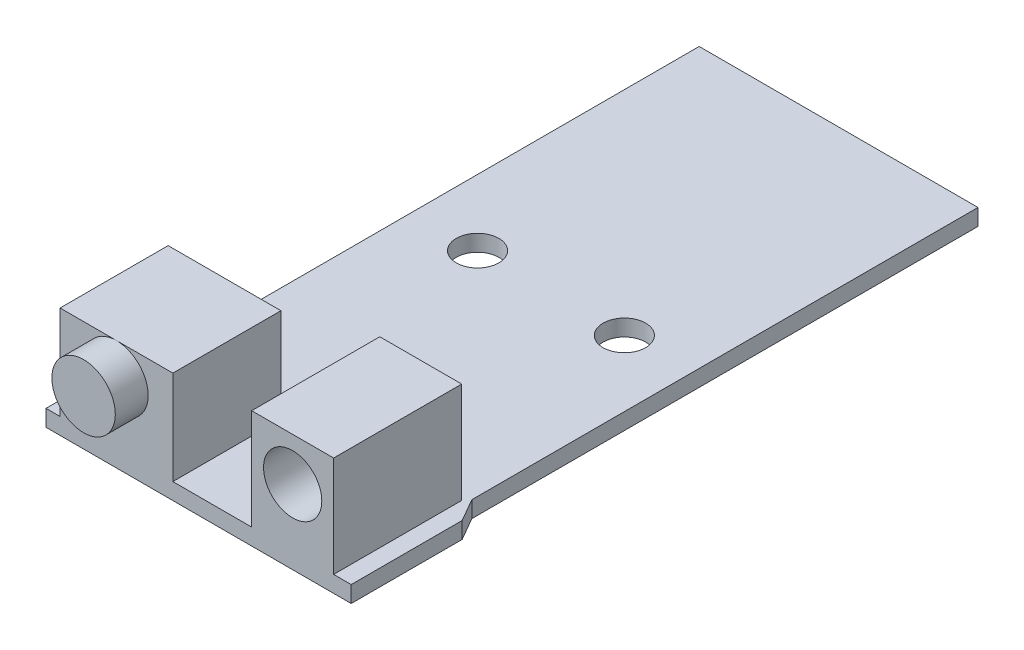
ISO-10303-21;
HEADER;
FILE_DESCRIPTION(('STEP AP214'),'2;1');
FILE_NAME('part.step','',(''),(''),'','','');
FILE_SCHEMA(('AUTOMOTIVE_DESIGN { 1 0 10303 214 1 1 1 1 }'));
ENDSEC;
DATA;
#1=APPLICATION_CONTEXT('core data for automotive mechanical design processes');
#2=APPLICATION_PROTOCOL_DEFINITION('international standard','automotive_design',2000,#1);
#3=PRODUCT_CONTEXT('',#1,'mechanical');
#4=PRODUCT('Part','Part','',(#3));
#5=PRODUCT_RELATED_PRODUCT_CATEGORY('part','',(#4));
#6=PRODUCT_DEFINITION_FORMATION('','',#4);
#7=PRODUCT_DEFINITION_CONTEXT('part definition',#1,'design');
#8=PRODUCT_DEFINITION('design','',#6,#7);
#9=PRODUCT_DEFINITION_SHAPE('','',#8);
#10=(LENGTH_UNIT() NAMED_UNIT(*) SI_UNIT(.MILLI.,.METRE.));
#11=(NAMED_UNIT(*) PLANE_ANGLE_UNIT() SI_UNIT($,.RADIAN.));
#12=(NAMED_UNIT(*) SI_UNIT($,.STERADIAN.) SOLID_ANGLE_UNIT());
#13=UNCERTAINTY_MEASURE_WITH_UNIT(LENGTH_MEASURE(1.E-05),#10,'distance_accuracy_value','');
#14=(GEOMETRIC_REPRESENTATION_CONTEXT(3) GLOBAL_UNCERTAINTY_ASSIGNED_CONTEXT((#13)) GLOBAL_UNIT_ASSIGNED_CONTEXT((#10,
#11,#12)) REPRESENTATION_CONTEXT('',''));
#15=CARTESIAN_POINT('',(0.,0.,0.));
#16=DIRECTION('',(0.,0.,1.));
#17=DIRECTION('',(1.,0.,0.));
#18=AXIS2_PLACEMENT_3D('',#15,#16,#17);
#19=CARTESIAN_POINT('',(0.,1.778,0.));
#20=DIRECTION('',(0.,-1.,0.));
#21=DIRECTION('',(0.,0.,-1.));
#22=AXIS2_PLACEMENT_3D('',#19,#20,#21);
#23=PLANE('',#22);
#24=CARTESIAN_POINT('',(7.9375,1.778,-38.1));
#25=DIRECTION('',(0.,1.,0.));
#26=DIRECTION('',(0.,0.,1.));
#27=AXIS2_PLACEMENT_3D('',#24,#25,#26);
#28=CIRCLE('',#27,2.3);
#29=CARTESIAN_POINT('',(7.9375,1.778,-35.8));
#30=VERTEX_POINT('',#29);
#31=EDGE_CURVE('E186',#30,#30,#28,.T.);
#32=ORIENTED_EDGE('',*,*,#31,.F.);
#33=EDGE_LOOP('',(#32));
#34=FACE_BOUND('',#33,.T.);
#35=CARTESIAN_POINT('',(-7.9375,1.778,-38.1));
#36=DIRECTION('',(0.,1.,0.));
#37=DIRECTION('',(0.,0.,1.));
#38=AXIS2_PLACEMENT_3D('',#35,#36,#37);
#39=CIRCLE('',#38,2.3);
#40=CARTESIAN_POINT('',(-7.9375,1.778,-35.8));
#41=VERTEX_POINT('',#40);
#42=EDGE_CURVE('E191',#41,#41,#39,.T.);
#43=ORIENTED_EDGE('',*,*,#42,.F.);
#44=EDGE_LOOP('',(#43));
#45=FACE_BOUND('',#44,.T.);
#46=DIRECTION('',(0.,0.,1.));
#47=VECTOR('',#46,1.);
#48=CARTESIAN_POINT('',(-14.976,1.778,0.));
#49=LINE('',#48,#47);
#50=CARTESIAN_POINT('',(-14.976,1.778,-11.684));
#51=VERTEX_POINT('',#50);
#52=CARTESIAN_POINT('',(-14.976,1.778,0.));
#53=VERTEX_POINT('',#52);
#54=EDGE_CURVE('E48',#51,#53,#49,.T.);
#55=ORIENTED_EDGE('',*,*,#54,.F.);
#56=DIRECTION('',(-1.,0.,0.));
#57=VECTOR('',#56,1.);
#58=CARTESIAN_POINT('',(-14.976,1.778,-11.684));
#59=LINE('',#58,#57);
#60=CARTESIAN_POINT('',(-2.784,1.778,-11.684));
#61=VERTEX_POINT('',#60);
#62=EDGE_CURVE('E52',#61,#51,#59,.T.);
#63=ORIENTED_EDGE('',*,*,#62,.F.);
#64=DIRECTION('',(0.,0.,-1.));
#65=VECTOR('',#64,1.);
#66=CARTESIAN_POINT('',(-2.784,1.778,0.));
#67=LINE('',#66,#65);
#68=CARTESIAN_POINT('',(-2.784,1.778,0.));
#69=VERTEX_POINT('',#68);
#70=EDGE_CURVE('E174',#69,#61,#67,.T.);
#71=ORIENTED_EDGE('',*,*,#70,.F.);
#72=DIRECTION('',(1.,0.,0.));
#73=VECTOR('',#72,1.);
#74=CARTESIAN_POINT('',(16.5,1.778,0.));
#75=LINE('',#74,#73);
#76=CARTESIAN_POINT('',(5.74,1.778,0.));
#77=VERTEX_POINT('',#76);
#78=EDGE_CURVE('E237',#69,#77,#75,.T.);
#79=ORIENTED_EDGE('',*,*,#78,.T.);
#80=DIRECTION('',(0.,0.,1.));
#81=VECTOR('',#80,1.);
#82=CARTESIAN_POINT('',(5.74,1.778,-13.85));
#83=LINE('',#82,#81);
#84=CARTESIAN_POINT('',(5.74,1.778,-13.85));
#85=VERTEX_POINT('',#84);
#86=EDGE_CURVE('E190',#85,#77,#83,.T.);
#87=ORIENTED_EDGE('',*,*,#86,.F.);
#88=DIRECTION('',(-1.,0.,0.));
#89=VECTOR('',#88,1.);
#90=CARTESIAN_POINT('',(5.74,1.778,-13.85));
#91=LINE('',#90,#89);
#92=CARTESIAN_POINT('',(14.6,1.778,-13.85));
#93=VERTEX_POINT('',#92);
#94=EDGE_CURVE('E203',#93,#85,#91,.T.);
#95=ORIENTED_EDGE('',*,*,#94,.F.);
#96=DIRECTION('',(0.,0.,-1.));
#97=VECTOR('',#96,1.);
#98=CARTESIAN_POINT('',(14.6,1.778,-13.85));
#99=LINE('',#98,#97);
#100=CARTESIAN_POINT('',(14.6,1.778,0.));
#101=VERTEX_POINT('',#100);
#102=EDGE_CURVE('E212',#101,#93,#99,.T.);
#103=ORIENTED_EDGE('',*,*,#102,.F.);
#104=CARTESIAN_POINT('',(16.5,1.778,0.));
#105=VERTEX_POINT('',#104);
#106=EDGE_CURVE('E232',#101,#105,#75,.T.);
#107=ORIENTED_EDGE('',*,*,#106,.T.);
#108=DIRECTION('',(0.,0.,-1.));
#109=VECTOR('',#108,1.);
#110=CARTESIAN_POINT('',(16.5,1.778,-12.));
#111=LINE('',#110,#109);
#112=CARTESIAN_POINT('',(16.5,1.778,-12.));
#113=VERTEX_POINT('',#112);
#114=EDGE_CURVE('E236',#105,#113,#111,.T.);
#115=ORIENTED_EDGE('',*,*,#114,.T.);
#116=DIRECTION('',(-0.500000000000001,0.,-0.866025403784438));
#117=VECTOR('',#116,1.);
#118=CARTESIAN_POINT('',(15.075,1.778,-14.4681724007856));
#119=LINE('',#118,#117);
#120=CARTESIAN_POINT('',(15.075,1.778,-14.4681724007856));
#121=VERTEX_POINT('',#120);
#122=EDGE_CURVE('E239',#113,#121,#119,.T.);
#123=ORIENTED_EDGE('',*,*,#122,.T.);
#124=DIRECTION('',(0.,0.,-1.));
#125=VECTOR('',#124,1.);
#126=CARTESIAN_POINT('',(15.075,1.778,-69.2));
#127=LINE('',#126,#125);
#128=CARTESIAN_POINT('',(15.075,1.778,-69.2));
#129=VERTEX_POINT('',#128);
#130=EDGE_CURVE('E241',#121,#129,#127,.T.);
#131=ORIENTED_EDGE('',*,*,#130,.T.);
#132=DIRECTION('',(-1.,0.,0.));
#133=VECTOR('',#132,1.);
#134=CARTESIAN_POINT('',(-15.075,1.778,-69.2));
#135=LINE('',#134,#133);
#136=CARTESIAN_POINT('',(-15.075,1.778,-69.2));
#137=VERTEX_POINT('',#136);
#138=EDGE_CURVE('E243',#129,#137,#135,.T.);
#139=ORIENTED_EDGE('',*,*,#138,.T.);
#140=DIRECTION('',(0.,0.,1.));
#141=VECTOR('',#140,1.);
#142=CARTESIAN_POINT('',(-15.075,1.778,-69.2));
#143=LINE('',#142,#141);
#144=CARTESIAN_POINT('',(-15.075,1.778,-14.4681724007856));
#145=VERTEX_POINT('',#144);
#146=EDGE_CURVE('E245',#137,#145,#143,.T.);
#147=ORIENTED_EDGE('',*,*,#146,.T.);
#148=DIRECTION('',(-0.500000000000001,0.,0.866025403784438));
#149=VECTOR('',#148,1.);
#150=CARTESIAN_POINT('',(-15.075,1.778,-14.4681724007856));
#151=LINE('',#150,#149);
#152=CARTESIAN_POINT('',(-16.5,1.778,-12.));
#153=VERTEX_POINT('',#152);
#154=EDGE_CURVE('E247',#145,#153,#151,.T.);
#155=ORIENTED_EDGE('',*,*,#154,.T.);
#156=DIRECTION('',(0.,0.,1.));
#157=VECTOR('',#156,1.);
#158=CARTESIAN_POINT('',(-16.5,1.778,-12.));
#159=LINE('',#158,#157);
#160=CARTESIAN_POINT('',(-16.5,1.778,0.));
#161=VERTEX_POINT('',#160);
#162=EDGE_CURVE('E229',#153,#161,#159,.T.);
#163=ORIENTED_EDGE('',*,*,#162,.T.);
#164=EDGE_CURVE('E234',#161,#53,#75,.T.);
#165=ORIENTED_EDGE('',*,*,#164,.T.);
#166=EDGE_LOOP('',(#55,#63,#71,#79,#87,#95,#103,#107,#115,#123,#131,#139,#147,#155,#163,#165));
#167=FACE_BOUND('',#166,.T.);
#168=ADVANCED_FACE('F33',(#34,#45,#167),#23,.F.);
#169=CARTESIAN_POINT('',(-16.5,1.778,-12.));
#170=DIRECTION('',(1.,0.,0.));
#171=DIRECTION('',(0.,0.,-1.));
#172=AXIS2_PLACEMENT_3D('',#169,#170,#171);
#173=PLANE('',#172);
#174=DIRECTION('',(0.,0.,1.));
#175=VECTOR('',#174,1.);
#176=CARTESIAN_POINT('',(-16.5,0.,-12.));
#177=LINE('',#176,#175);
#178=CARTESIAN_POINT('',(-16.5,0.,-12.));
#179=VERTEX_POINT('',#178);
#180=CARTESIAN_POINT('',(-16.5,0.,0.));
#181=VERTEX_POINT('',#180);
#182=EDGE_CURVE('E228',#179,#181,#177,.T.);
#183=ORIENTED_EDGE('',*,*,#182,.T.);
#184=DIRECTION('',(0.,-1.,0.));
#185=VECTOR('',#184,1.);
#186=CARTESIAN_POINT('',(-16.5,1.778,0.));
#187=LINE('',#186,#185);
#188=EDGE_CURVE('E11',#161,#181,#187,.T.);
#189=ORIENTED_EDGE('',*,*,#188,.F.);
#190=ORIENTED_EDGE('',*,*,#162,.F.);
#191=DIRECTION('',(0.,-1.,0.));
#192=VECTOR('',#191,1.);
#193=CARTESIAN_POINT('',(-16.5,1.778,-12.));
#194=LINE('',#193,#192);
#195=EDGE_CURVE('E249',#153,#179,#194,.T.);
#196=ORIENTED_EDGE('',*,*,#195,.T.);
#197=EDGE_LOOP('',(#183,#189,#190,#196));
#198=FACE_BOUND('',#197,.T.);
#199=ADVANCED_FACE('F35',(#198),#173,.F.);
#200=CARTESIAN_POINT('',(16.5,1.778,0.));
#201=DIRECTION('',(0.,0.,-1.));
#202=DIRECTION('',(-1.,0.,0.));
#203=AXIS2_PLACEMENT_3D('',#200,#201,#202);
#204=PLANE('',#203);
#205=CARTESIAN_POINT('',(10.17,8.0044,0.));
#206=DIRECTION('',(0.,0.,1.));
#207=DIRECTION('',(1.,0.,0.));
#208=AXIS2_PLACEMENT_3D('',#205,#206,#207);
#209=CIRCLE('',#208,3.1496);
#210=CARTESIAN_POINT('',(13.3196,8.0044,0.));
#211=VERTEX_POINT('',#210);
#212=EDGE_CURVE('E373',#211,#211,#209,.T.);
#213=ORIENTED_EDGE('',*,*,#212,.F.);
#214=EDGE_LOOP('',(#213));
#215=FACE_BOUND('',#214,.T.);
#216=DIRECTION('',(1.,0.,0.));
#217=VECTOR('',#216,1.);
#218=CARTESIAN_POINT('',(-14.976,11.938,0.));
#219=LINE('',#218,#217);
#220=CARTESIAN_POINT('',(-8.88,11.938,0.));
#221=VERTEX_POINT('',#220);
#222=CARTESIAN_POINT('',(-2.784,11.938,0.));
#223=VERTEX_POINT('',#222);
#224=EDGE_CURVE('E150',#221,#223,#219,.T.);
#225=ORIENTED_EDGE('',*,*,#224,.F.);
#226=CARTESIAN_POINT('',(-8.88,8.509,0.));
#227=DIRECTION('',(0.,0.,1.));
#228=DIRECTION('',(1.,0.,0.));
#229=AXIS2_PLACEMENT_3D('',#226,#227,#228);
#230=CIRCLE('',#229,3.429);
#231=EDGE_CURVE('E162',#221,#221,#230,.T.);
#232=ORIENTED_EDGE('',*,*,#231,.F.);
#233=CARTESIAN_POINT('',(-14.976,11.938,0.));
#234=VERTEX_POINT('',#233);
#235=EDGE_CURVE('E147',#234,#221,#219,.T.);
#236=ORIENTED_EDGE('',*,*,#235,.F.);
#237=DIRECTION('',(0.,-1.,0.));
#238=VECTOR('',#237,1.);
#239=CARTESIAN_POINT('',(-14.976,11.938,0.));
#240=LINE('',#239,#238);
#241=EDGE_CURVE('E184',#234,#53,#240,.T.);
#242=ORIENTED_EDGE('',*,*,#241,.T.);
#243=ORIENTED_EDGE('',*,*,#164,.F.);
#244=ORIENTED_EDGE('',*,*,#188,.T.);
#245=DIRECTION('',(1.,0.,0.));
#246=VECTOR('',#245,1.);
#247=CARTESIAN_POINT('',(16.5,0.,0.));
#248=LINE('',#247,#246);
#249=CARTESIAN_POINT('',(16.5,0.,0.));
#250=VERTEX_POINT('',#249);
#251=EDGE_CURVE('E252',#181,#250,#248,.T.);
#252=ORIENTED_EDGE('',*,*,#251,.T.);
#253=DIRECTION('',(0.,-1.,0.));
#254=VECTOR('',#253,1.);
#255=CARTESIAN_POINT('',(16.5,1.778,0.));
#256=LINE('',#255,#254);
#257=EDGE_CURVE('E41',#105,#250,#256,.T.);
#258=ORIENTED_EDGE('',*,*,#257,.F.);
#259=ORIENTED_EDGE('',*,*,#106,.F.);
#260=DIRECTION('',(0.,-1.,0.));
#261=VECTOR('',#260,1.);
#262=CARTESIAN_POINT('',(14.6,12.678,0.));
#263=LINE('',#262,#261);
#264=CARTESIAN_POINT('',(14.6,12.678,0.));
#265=VERTEX_POINT('',#264);
#266=EDGE_CURVE('E222',#265,#101,#263,.T.);
#267=ORIENTED_EDGE('',*,*,#266,.F.);
#268=DIRECTION('',(1.,0.,0.));
#269=VECTOR('',#268,1.);
#270=CARTESIAN_POINT('',(5.74,12.678,0.));
#271=LINE('',#270,#269);
#272=CARTESIAN_POINT('',(5.74,12.678,0.));
#273=VERTEX_POINT('',#272);
#274=EDGE_CURVE('E202',#273,#265,#271,.T.);
#275=ORIENTED_EDGE('',*,*,#274,.F.);
#276=DIRECTION('',(0.,-1.,0.));
#277=VECTOR('',#276,1.);
#278=CARTESIAN_POINT('',(5.74,12.678,0.));
#279=LINE('',#278,#277);
#280=EDGE_CURVE('E225',#273,#77,#279,.T.);
#281=ORIENTED_EDGE('',*,*,#280,.T.);
#282=ORIENTED_EDGE('',*,*,#78,.F.);
#283=DIRECTION('',(0.,-1.,0.));
#284=VECTOR('',#283,1.);
#285=CARTESIAN_POINT('',(-2.784,11.938,0.));
#286=LINE('',#285,#284);
#287=EDGE_CURVE('E164',#223,#69,#286,.T.);
#288=ORIENTED_EDGE('',*,*,#287,.F.);
#289=EDGE_LOOP('',(#225,#232,#236,#242,#243,#244,#252,#258,#259,#267,#275,#281,#282,#288));
#290=FACE_BOUND('',#289,.T.);
#291=ADVANCED_FACE('F160',(#215,#290),#204,.F.);
#292=CARTESIAN_POINT('',(16.5,1.778,-12.));
#293=DIRECTION('',(-1.,0.,0.));
#294=DIRECTION('',(0.,0.,1.));
#295=AXIS2_PLACEMENT_3D('',#292,#293,#294);
#296=PLANE('',#295);
#297=DIRECTION('',(0.,0.,-1.));
#298=VECTOR('',#297,1.);
#299=CARTESIAN_POINT('',(16.5,0.,-12.));
#300=LINE('',#299,#298);
#301=CARTESIAN_POINT('',(16.5,0.,-12.));
#302=VERTEX_POINT('',#301);
#303=EDGE_CURVE('E254',#250,#302,#300,.T.);
#304=ORIENTED_EDGE('',*,*,#303,.T.);
#305=DIRECTION('',(0.,-1.,0.));
#306=VECTOR('',#305,1.);
#307=CARTESIAN_POINT('',(16.5,1.778,-12.));
#308=LINE('',#307,#306);
#309=EDGE_CURVE('E279',#113,#302,#308,.T.);
#310=ORIENTED_EDGE('',*,*,#309,.F.);
#311=ORIENTED_EDGE('',*,*,#114,.F.);
#312=ORIENTED_EDGE('',*,*,#257,.T.);
#313=EDGE_LOOP('',(#304,#310,#311,#312));
#314=FACE_BOUND('',#313,.T.);
#315=ADVANCED_FACE('F286',(#314),#296,.F.);
#316=CARTESIAN_POINT('',(15.075,1.778,-14.4681724007856));
#317=DIRECTION('',(-0.866025403784438,0.,0.500000000000001));
#318=DIRECTION('',(0.500000000000001,0.,0.866025403784438));
#319=AXIS2_PLACEMENT_3D('',#316,#317,#318);
#320=PLANE('',#319);
#321=DIRECTION('',(-0.500000000000001,0.,-0.866025403784438));
#322=VECTOR('',#321,1.);
#323=CARTESIAN_POINT('',(15.075,0.,-14.4681724007856));
#324=LINE('',#323,#322);
#325=CARTESIAN_POINT('',(15.075,0.,-14.4681724007856));
#326=VERTEX_POINT('',#325);
#327=EDGE_CURVE('E256',#302,#326,#324,.T.);
#328=ORIENTED_EDGE('',*,*,#327,.T.);
#329=DIRECTION('',(0.,-1.,0.));
#330=VECTOR('',#329,1.);
#331=CARTESIAN_POINT('',(15.075,1.778,-14.4681724007856));
#332=LINE('',#331,#330);
#333=EDGE_CURVE('E276',#121,#326,#332,.T.);
#334=ORIENTED_EDGE('',*,*,#333,.F.);
#335=ORIENTED_EDGE('',*,*,#122,.F.);
#336=ORIENTED_EDGE('',*,*,#309,.T.);
#337=EDGE_LOOP('',(#328,#334,#335,#336));
#338=FACE_BOUND('',#337,.T.);
#339=ADVANCED_FACE('F297',(#338),#320,.F.);
#340=CARTESIAN_POINT('',(15.075,1.778,-69.2));
#341=DIRECTION('',(-1.,0.,0.));
#342=DIRECTION('',(0.,0.,1.));
#343=AXIS2_PLACEMENT_3D('',#340,#341,#342);
#344=PLANE('',#343);
#345=DIRECTION('',(0.,0.,-1.));
#346=VECTOR('',#345,1.);
#347=CARTESIAN_POINT('',(15.075,0.,-69.2));
#348=LINE('',#347,#346);
#349=CARTESIAN_POINT('',(15.075,0.,-69.2));
#350=VERTEX_POINT('',#349);
#351=EDGE_CURVE('E258',#326,#350,#348,.T.);
#352=ORIENTED_EDGE('',*,*,#351,.T.);
#353=DIRECTION('',(0.,-1.,0.));
#354=VECTOR('',#353,1.);
#355=CARTESIAN_POINT('',(15.075,1.778,-69.2));
#356=LINE('',#355,#354);
#357=EDGE_CURVE('E273',#129,#350,#356,.T.);
#358=ORIENTED_EDGE('',*,*,#357,.F.);
#359=ORIENTED_EDGE('',*,*,#130,.F.);
#360=ORIENTED_EDGE('',*,*,#333,.T.);
#361=EDGE_LOOP('',(#352,#358,#359,#360));
#362=FACE_BOUND('',#361,.T.);
#363=ADVANCED_FACE('F301',(#362),#344,.F.);
#364=CARTESIAN_POINT('',(-15.075,1.778,-69.2));
#365=DIRECTION('',(0.,0.,1.));
#366=DIRECTION('',(1.,0.,0.));
#367=AXIS2_PLACEMENT_3D('',#364,#365,#366);
#368=PLANE('',#367);
#369=DIRECTION('',(-1.,0.,0.));
#370=VECTOR('',#369,1.);
#371=CARTESIAN_POINT('',(-15.075,0.,-69.2));
#372=LINE('',#371,#370);
#373=CARTESIAN_POINT('',(-15.075,0.,-69.2));
#374=VERTEX_POINT('',#373);
#375=EDGE_CURVE('E260',#350,#374,#372,.T.);
#376=ORIENTED_EDGE('',*,*,#375,.T.);
#377=DIRECTION('',(0.,-1.,0.));
#378=VECTOR('',#377,1.);
#379=CARTESIAN_POINT('',(-15.075,1.778,-69.2));
#380=LINE('',#379,#378);
#381=EDGE_CURVE('E270',#137,#374,#380,.T.);
#382=ORIENTED_EDGE('',*,*,#381,.F.);
#383=ORIENTED_EDGE('',*,*,#138,.F.);
#384=ORIENTED_EDGE('',*,*,#357,.T.);
#385=EDGE_LOOP('',(#376,#382,#383,#384));
#386=FACE_BOUND('',#385,.T.);
#387=ADVANCED_FACE('F355',(#386),#368,.F.);
#388=CARTESIAN_POINT('',(-15.075,1.778,-69.2));
#389=DIRECTION('',(1.,0.,0.));
#390=DIRECTION('',(0.,0.,-1.));
#391=AXIS2_PLACEMENT_3D('',#388,#389,#390);
#392=PLANE('',#391);
#393=DIRECTION('',(0.,0.,1.));
#394=VECTOR('',#393,1.);
#395=CARTESIAN_POINT('',(-15.075,0.,-69.2));
#396=LINE('',#395,#394);
#397=CARTESIAN_POINT('',(-15.075,0.,-14.4681724007856));
#398=VERTEX_POINT('',#397);
#399=EDGE_CURVE('E262',#374,#398,#396,.T.);
#400=ORIENTED_EDGE('',*,*,#399,.T.);
#401=DIRECTION('',(0.,-1.,0.));
#402=VECTOR('',#401,1.);
#403=CARTESIAN_POINT('',(-15.075,1.778,-14.4681724007856));
#404=LINE('',#403,#402);
#405=EDGE_CURVE('E267',#145,#398,#404,.T.);
#406=ORIENTED_EDGE('',*,*,#405,.F.);
#407=ORIENTED_EDGE('',*,*,#146,.F.);
#408=ORIENTED_EDGE('',*,*,#381,.T.);
#409=EDGE_LOOP('',(#400,#406,#407,#408));
#410=FACE_BOUND('',#409,.T.);
#411=ADVANCED_FACE('F351',(#410),#392,.F.);
#412=CARTESIAN_POINT('',(-15.075,1.778,-14.4681724007856));
#413=DIRECTION('',(0.866025403784438,0.,0.500000000000001));
#414=DIRECTION('',(0.500000000000001,0.,-0.866025403784438));
#415=AXIS2_PLACEMENT_3D('',#412,#413,#414);
#416=PLANE('',#415);
#417=DIRECTION('',(-0.500000000000001,0.,0.866025403784438));
#418=VECTOR('',#417,1.);
#419=CARTESIAN_POINT('',(-15.075,0.,-14.4681724007856));
#420=LINE('',#419,#418);
#421=EDGE_CURVE('E233',#398,#179,#420,.T.);
#422=ORIENTED_EDGE('',*,*,#421,.T.);
#423=ORIENTED_EDGE('',*,*,#195,.F.);
#424=ORIENTED_EDGE('',*,*,#154,.F.);
#425=ORIENTED_EDGE('',*,*,#405,.T.);
#426=EDGE_LOOP('',(#422,#423,#424,#425));
#427=FACE_BOUND('',#426,.T.);
#428=ADVANCED_FACE('F347',(#427),#416,.F.);
#429=CARTESIAN_POINT('',(0.,0.,0.));
#430=DIRECTION('',(0.,-1.,0.));
#431=DIRECTION('',(0.,0.,-1.));
#432=AXIS2_PLACEMENT_3D('',#429,#430,#431);
#433=PLANE('',#432);
#434=CARTESIAN_POINT('',(-7.9375,0.,-38.1));
#435=DIRECTION('',(0.,1.,0.));
#436=DIRECTION('',(0.,0.,1.));
#437=AXIS2_PLACEMENT_3D('',#434,#435,#436);
#438=CIRCLE('',#437,2.3);
#439=CARTESIAN_POINT('',(-7.9375,0.,-35.8));
#440=VERTEX_POINT('',#439);
#441=EDGE_CURVE('E187',#440,#440,#438,.T.);
#442=ORIENTED_EDGE('',*,*,#441,.T.);
#443=EDGE_LOOP('',(#442));
#444=FACE_BOUND('',#443,.T.);
#445=CARTESIAN_POINT('',(7.9375,0.,-38.1));
#446=DIRECTION('',(0.,1.,0.));
#447=DIRECTION('',(0.,0.,1.));
#448=AXIS2_PLACEMENT_3D('',#445,#446,#447);
#449=CIRCLE('',#448,2.3);
#450=CARTESIAN_POINT('',(7.9375,0.,-35.8));
#451=VERTEX_POINT('',#450);
#452=EDGE_CURVE('E194',#451,#451,#449,.T.);
#453=ORIENTED_EDGE('',*,*,#452,.T.);
#454=EDGE_LOOP('',(#453));
#455=FACE_BOUND('',#454,.T.);
#456=ORIENTED_EDGE('',*,*,#182,.F.);
#457=ORIENTED_EDGE('',*,*,#421,.F.);
#458=ORIENTED_EDGE('',*,*,#399,.F.);
#459=ORIENTED_EDGE('',*,*,#375,.F.);
#460=ORIENTED_EDGE('',*,*,#351,.F.);
#461=ORIENTED_EDGE('',*,*,#327,.F.);
#462=ORIENTED_EDGE('',*,*,#303,.F.);
#463=ORIENTED_EDGE('',*,*,#251,.F.);
#464=EDGE_LOOP('',(#456,#457,#458,#459,#460,#461,#462,#463));
#465=FACE_BOUND('',#464,.T.);
#466=ADVANCED_FACE('F292',(#444,#455,#465),#433,.T.);
#467=CARTESIAN_POINT('',(5.74,12.678,-13.85));
#468=DIRECTION('',(1.,0.,0.));
#469=DIRECTION('',(0.,0.,-1.));
#470=AXIS2_PLACEMENT_3D('',#467,#468,#469);
#471=PLANE('',#470);
#472=ORIENTED_EDGE('',*,*,#86,.T.);
#473=ORIENTED_EDGE('',*,*,#280,.F.);
#474=DIRECTION('',(0.,0.,1.));
#475=VECTOR('',#474,1.);
#476=CARTESIAN_POINT('',(5.74,12.678,-13.85));
#477=LINE('',#476,#475);
#478=CARTESIAN_POINT('',(5.74,12.678,-13.85));
#479=VERTEX_POINT('',#478);
#480=EDGE_CURVE('E199',#479,#273,#477,.T.);
#481=ORIENTED_EDGE('',*,*,#480,.F.);
#482=DIRECTION('',(0.,-1.,0.));
#483=VECTOR('',#482,1.);
#484=CARTESIAN_POINT('',(5.74,12.678,-13.85));
#485=LINE('',#484,#483);
#486=EDGE_CURVE('E209',#479,#85,#485,.T.);
#487=ORIENTED_EDGE('',*,*,#486,.T.);
#488=EDGE_LOOP('',(#472,#473,#481,#487));
#489=FACE_BOUND('',#488,.T.);
#490=ADVANCED_FACE('F309',(#489),#471,.F.);
#491=CARTESIAN_POINT('',(14.6,12.678,-13.85));
#492=DIRECTION('',(-1.,0.,0.));
#493=DIRECTION('',(0.,0.,1.));
#494=AXIS2_PLACEMENT_3D('',#491,#492,#493);
#495=PLANE('',#494);
#496=ORIENTED_EDGE('',*,*,#102,.T.);
#497=DIRECTION('',(0.,-1.,0.));
#498=VECTOR('',#497,1.);
#499=CARTESIAN_POINT('',(14.6,12.678,-13.85));
#500=LINE('',#499,#498);
#501=CARTESIAN_POINT('',(14.6,12.678,-13.85));
#502=VERTEX_POINT('',#501);
#503=EDGE_CURVE('E219',#502,#93,#500,.T.);
#504=ORIENTED_EDGE('',*,*,#503,.F.);
#505=DIRECTION('',(0.,0.,-1.));
#506=VECTOR('',#505,1.);
#507=CARTESIAN_POINT('',(14.6,12.678,-13.85));
#508=LINE('',#507,#506);
#509=EDGE_CURVE('E205',#265,#502,#508,.T.);
#510=ORIENTED_EDGE('',*,*,#509,.F.);
#511=ORIENTED_EDGE('',*,*,#266,.T.);
#512=EDGE_LOOP('',(#496,#504,#510,#511));
#513=FACE_BOUND('',#512,.T.);
#514=ADVANCED_FACE('F316',(#513),#495,.F.);
#515=CARTESIAN_POINT('',(5.74,12.678,-13.85));
#516=DIRECTION('',(0.,0.,1.));
#517=DIRECTION('',(1.,0.,0.));
#518=AXIS2_PLACEMENT_3D('',#515,#516,#517);
#519=PLANE('',#518);
#520=ORIENTED_EDGE('',*,*,#94,.T.);
#521=ORIENTED_EDGE('',*,*,#486,.F.);
#522=DIRECTION('',(-1.,0.,0.));
#523=VECTOR('',#522,1.);
#524=CARTESIAN_POINT('',(5.74,12.678,-13.85));
#525=LINE('',#524,#523);
#526=EDGE_CURVE('E207',#502,#479,#525,.T.);
#527=ORIENTED_EDGE('',*,*,#526,.F.);
#528=ORIENTED_EDGE('',*,*,#503,.T.);
#529=EDGE_LOOP('',(#520,#521,#527,#528));
#530=FACE_BOUND('',#529,.T.);
#531=ADVANCED_FACE('F313',(#530),#519,.F.);
#532=CARTESIAN_POINT('',(0.,12.678,0.));
#533=DIRECTION('',(0.,1.,0.));
#534=DIRECTION('',(0.,0.,1.));
#535=AXIS2_PLACEMENT_3D('',#532,#533,#534);
#536=PLANE('',#535);
#537=ORIENTED_EDGE('',*,*,#480,.T.);
#538=ORIENTED_EDGE('',*,*,#274,.T.);
#539=ORIENTED_EDGE('',*,*,#509,.T.);
#540=ORIENTED_EDGE('',*,*,#526,.T.);
#541=EDGE_LOOP('',(#537,#538,#539,#540));
#542=FACE_BOUND('',#541,.T.);
#543=ADVANCED_FACE('F319',(#542),#536,.T.);
#544=CARTESIAN_POINT('',(7.9375,0.,-38.1));
#545=DIRECTION('',(0.,1.,0.));
#546=DIRECTION('',(0.,0.,1.));
#547=AXIS2_PLACEMENT_3D('',#544,#545,#546);
#548=CYLINDRICAL_SURFACE('',#547,2.3);
#549=ORIENTED_EDGE('',*,*,#452,.F.);
#550=EDGE_LOOP('',(#549));
#551=FACE_BOUND('',#550,.T.);
#552=ORIENTED_EDGE('',*,*,#31,.T.);
#553=EDGE_LOOP('',(#552));
#554=FACE_BOUND('',#553,.T.);
#555=ADVANCED_FACE('F321',(#551,#554),#548,.F.);
#556=CARTESIAN_POINT('',(-7.9375,0.,-38.1));
#557=DIRECTION('',(0.,1.,0.));
#558=DIRECTION('',(0.,0.,1.));
#559=AXIS2_PLACEMENT_3D('',#556,#557,#558);
#560=CYLINDRICAL_SURFACE('',#559,2.3);
#561=ORIENTED_EDGE('',*,*,#441,.F.);
#562=EDGE_LOOP('',(#561));
#563=FACE_BOUND('',#562,.T.);
#564=ORIENTED_EDGE('',*,*,#42,.T.);
#565=EDGE_LOOP('',(#564));
#566=FACE_BOUND('',#565,.T.);
#567=ADVANCED_FACE('F327',(#563,#566),#560,.F.);
#568=CARTESIAN_POINT('',(-14.976,11.938,0.));
#569=DIRECTION('',(1.,0.,0.));
#570=DIRECTION('',(0.,0.,-1.));
#571=AXIS2_PLACEMENT_3D('',#568,#569,#570);
#572=PLANE('',#571);
#573=ORIENTED_EDGE('',*,*,#54,.T.);
#574=ORIENTED_EDGE('',*,*,#241,.F.);
#575=DIRECTION('',(0.,0.,1.));
#576=VECTOR('',#575,1.);
#577=CARTESIAN_POINT('',(-14.976,11.938,0.));
#578=LINE('',#577,#576);
#579=CARTESIAN_POINT('',(-14.976,11.938,-11.684));
#580=VERTEX_POINT('',#579);
#581=EDGE_CURVE('E153',#580,#234,#578,.T.);
#582=ORIENTED_EDGE('',*,*,#581,.F.);
#583=DIRECTION('',(0.,-1.,0.));
#584=VECTOR('',#583,1.);
#585=CARTESIAN_POINT('',(-14.976,11.938,-11.684));
#586=LINE('',#585,#584);
#587=EDGE_CURVE('E172',#580,#51,#586,.T.);
#588=ORIENTED_EDGE('',*,*,#587,.T.);
#589=EDGE_LOOP('',(#573,#574,#582,#588));
#590=FACE_BOUND('',#589,.T.);
#591=ADVANCED_FACE('F405',(#590),#572,.F.);
#592=CARTESIAN_POINT('',(-2.784,11.938,0.));
#593=DIRECTION('',(-1.,0.,0.));
#594=DIRECTION('',(0.,0.,1.));
#595=AXIS2_PLACEMENT_3D('',#592,#593,#594);
#596=PLANE('',#595);
#597=ORIENTED_EDGE('',*,*,#70,.T.);
#598=DIRECTION('',(0.,-1.,0.));
#599=VECTOR('',#598,1.);
#600=CARTESIAN_POINT('',(-2.784,11.938,-11.684));
#601=LINE('',#600,#599);
#602=CARTESIAN_POINT('',(-2.784,11.938,-11.684));
#603=VERTEX_POINT('',#602);
#604=EDGE_CURVE('E180',#603,#61,#601,.T.);
#605=ORIENTED_EDGE('',*,*,#604,.F.);
#606=DIRECTION('',(0.,0.,-1.));
#607=VECTOR('',#606,1.);
#608=CARTESIAN_POINT('',(-2.784,11.938,0.));
#609=LINE('',#608,#607);
#610=EDGE_CURVE('E158',#223,#603,#609,.T.);
#611=ORIENTED_EDGE('',*,*,#610,.F.);
#612=ORIENTED_EDGE('',*,*,#287,.T.);
#613=EDGE_LOOP('',(#597,#605,#611,#612));
#614=FACE_BOUND('',#613,.T.);
#615=ADVANCED_FACE('F401',(#614),#596,.F.);
#616=CARTESIAN_POINT('',(-14.976,11.938,-11.684));
#617=DIRECTION('',(0.,0.,1.));
#618=DIRECTION('',(1.,0.,0.));
#619=AXIS2_PLACEMENT_3D('',#616,#617,#618);
#620=PLANE('',#619);
#621=ORIENTED_EDGE('',*,*,#62,.T.);
#622=ORIENTED_EDGE('',*,*,#587,.F.);
#623=DIRECTION('',(-1.,0.,0.));
#624=VECTOR('',#623,1.);
#625=CARTESIAN_POINT('',(-14.976,11.938,-11.684));
#626=LINE('',#625,#624);
#627=EDGE_CURVE('E170',#603,#580,#626,.T.);
#628=ORIENTED_EDGE('',*,*,#627,.F.);
#629=ORIENTED_EDGE('',*,*,#604,.T.);
#630=EDGE_LOOP('',(#621,#622,#628,#629));
#631=FACE_BOUND('',#630,.T.);
#632=ADVANCED_FACE('F394',(#631),#620,.F.);
#633=CARTESIAN_POINT('',(0.,11.938,0.));
#634=DIRECTION('',(0.,-1.,0.));
#635=DIRECTION('',(0.,0.,-1.));
#636=AXIS2_PLACEMENT_3D('',#633,#634,#635);
#637=PLANE('',#636);
#638=ORIENTED_EDGE('',*,*,#581,.T.);
#639=ORIENTED_EDGE('',*,*,#235,.T.);
#640=ORIENTED_EDGE('',*,*,#224,.T.);
#641=ORIENTED_EDGE('',*,*,#610,.T.);
#642=ORIENTED_EDGE('',*,*,#627,.T.);
#643=EDGE_LOOP('',(#638,#639,#640,#641,#642));
#644=FACE_BOUND('',#643,.T.);
#645=ADVANCED_FACE('F149',(#644),#637,.F.);
#646=CARTESIAN_POINT('',(-8.88,8.509,3.556));
#647=DIRECTION('',(0.,0.,-1.));
#648=DIRECTION('',(-1.,0.,0.));
#649=AXIS2_PLACEMENT_3D('',#646,#647,#648);
#650=CYLINDRICAL_SURFACE('',#649,3.429);
#651=CARTESIAN_POINT('',(-8.88,8.509,3.556));
#652=DIRECTION('',(0.,0.,1.));
#653=DIRECTION('',(1.,0.,0.));
#654=AXIS2_PLACEMENT_3D('',#651,#652,#653);
#655=CIRCLE('',#654,3.429);
#656=CARTESIAN_POINT('',(-5.451,8.509,3.556));
#657=VERTEX_POINT('',#656);
#658=EDGE_CURVE('E175',#657,#657,#655,.T.);
#659=ORIENTED_EDGE('',*,*,#658,.F.);
#660=EDGE_LOOP('',(#659));
#661=FACE_BOUND('',#660,.T.);
#662=ORIENTED_EDGE('',*,*,#231,.T.);
#663=EDGE_LOOP('',(#662));
#664=FACE_BOUND('',#663,.T.);
#665=ADVANCED_FACE('F382',(#661,#664),#650,.T.);
#666=CARTESIAN_POINT('',(-8.88,8.509,3.556));
#667=DIRECTION('',(0.,0.,1.));
#668=DIRECTION('',(1.,0.,0.));
#669=AXIS2_PLACEMENT_3D('',#666,#667,#668);
#670=PLANE('',#669);
#671=ORIENTED_EDGE('',*,*,#658,.T.);
#672=EDGE_LOOP('',(#671));
#673=FACE_BOUND('',#672,.T.);
#674=ADVANCED_FACE('F384',(#673),#670,.T.);
#675=CARTESIAN_POINT('',(10.17,8.0044,-11.656));
#676=DIRECTION('',(0.,0.,1.));
#677=DIRECTION('',(1.,0.,0.));
#678=AXIS2_PLACEMENT_3D('',#675,#676,#677);
#679=CYLINDRICAL_SURFACE('',#678,3.1496);
#680=CARTESIAN_POINT('',(10.17,8.0044,-11.656));
#681=DIRECTION('',(0.,0.,1.));
#682=DIRECTION('',(1.,0.,0.));
#683=AXIS2_PLACEMENT_3D('',#680,#681,#682);
#684=CIRCLE('',#683,3.1496);
#685=CARTESIAN_POINT('',(13.3196,8.0044,-11.656));
#686=VERTEX_POINT('',#685);
#687=EDGE_CURVE('E375',#686,#686,#684,.T.);
#688=CARTESIAN_POINT('',(13.3196,8.0044,-11.656));
#689=CARTESIAN_POINT('',(13.3196,8.0044,-11.5345833333333));
#690=CARTESIAN_POINT('',(13.3196,8.0044,-11.4131666666667));
#691=CARTESIAN_POINT('',(13.3196,8.0044,-11.1703333333333));
#692=CARTESIAN_POINT('',(13.3196,8.0044,-11.0489166666667));
#693=CARTESIAN_POINT('',(13.3196,8.0044,-10.8060833333333));
#694=CARTESIAN_POINT('',(13.3196,8.0044,-10.6846666666667));
#695=CARTESIAN_POINT('',(13.3196,8.0044,-10.4418333333333));
#696=CARTESIAN_POINT('',(13.3196,8.0044,-10.3204166666667));
#697=CARTESIAN_POINT('',(13.3196,8.0044,-10.0775833333333));
#698=CARTESIAN_POINT('',(13.3196,8.0044,-9.95616666666667));
#699=CARTESIAN_POINT('',(13.3196,8.0044,-9.71333333333333));
#700=CARTESIAN_POINT('',(13.3196,8.0044,-9.59191666666667));
#701=CARTESIAN_POINT('',(13.3196,8.0044,-9.34908333333333));
#702=CARTESIAN_POINT('',(13.3196,8.0044,-9.22766666666667));
#703=CARTESIAN_POINT('',(13.3196,8.0044,-8.98483333333333));
#704=CARTESIAN_POINT('',(13.3196,8.0044,-8.86341666666667));
#705=CARTESIAN_POINT('',(13.3196,8.0044,-8.62058333333333));
#706=CARTESIAN_POINT('',(13.3196,8.0044,-8.49916666666667));
#707=CARTESIAN_POINT('',(13.3196,8.0044,-8.25633333333333));
#708=CARTESIAN_POINT('',(13.3196,8.0044,-8.13491666666667));
#709=CARTESIAN_POINT('',(13.3196,8.0044,-7.89208333333333));
#710=CARTESIAN_POINT('',(13.3196,8.0044,-7.77066666666667));
#711=CARTESIAN_POINT('',(13.3196,8.0044,-7.52783333333333));
#712=CARTESIAN_POINT('',(13.3196,8.0044,-7.40641666666667));
#713=CARTESIAN_POINT('',(13.3196,8.0044,-7.16358333333333));
#714=CARTESIAN_POINT('',(13.3196,8.0044,-7.04216666666666));
#715=CARTESIAN_POINT('',(13.3196,8.0044,-6.79933333333333));
#716=CARTESIAN_POINT('',(13.3196,8.0044,-6.67791666666667));
#717=CARTESIAN_POINT('',(13.3196,8.0044,-6.43508333333333));
#718=CARTESIAN_POINT('',(13.3196,8.0044,-6.31366666666667));
#719=CARTESIAN_POINT('',(13.3196,8.0044,-6.07083333333333));
#720=CARTESIAN_POINT('',(13.3196,8.0044,-5.94941666666667));
#721=CARTESIAN_POINT('',(13.3196,8.0044,-5.70658333333333));
#722=CARTESIAN_POINT('',(13.3196,8.0044,-5.58516666666667));
#723=CARTESIAN_POINT('',(13.3196,8.0044,-5.34233333333333));
#724=CARTESIAN_POINT('',(13.3196,8.0044,-5.22091666666667));
#725=CARTESIAN_POINT('',(13.3196,8.0044,-4.97808333333333));
#726=CARTESIAN_POINT('',(13.3196,8.0044,-4.85666666666667));
#727=CARTESIAN_POINT('',(13.3196,8.0044,-4.61383333333333));
#728=CARTESIAN_POINT('',(13.3196,8.0044,-4.49241666666667));
#729=CARTESIAN_POINT('',(13.3196,8.0044,-4.24958333333333));
#730=CARTESIAN_POINT('',(13.3196,8.0044,-4.12816666666667));
#731=CARTESIAN_POINT('',(13.3196,8.0044,-3.88533333333333));
#732=CARTESIAN_POINT('',(13.3196,8.0044,-3.76391666666667));
#733=CARTESIAN_POINT('',(13.3196,8.0044,-3.52108333333333));
#734=CARTESIAN_POINT('',(13.3196,8.0044,-3.39966666666667));
#735=CARTESIAN_POINT('',(13.3196,8.0044,-3.15683333333333));
#736=CARTESIAN_POINT('',(13.3196,8.0044,-3.03541666666667));
#737=CARTESIAN_POINT('',(13.3196,8.0044,-2.79258333333333));
#738=CARTESIAN_POINT('',(13.3196,8.0044,-2.67116666666667));
#739=CARTESIAN_POINT('',(13.3196,8.0044,-2.42833333333333));
#740=CARTESIAN_POINT('',(13.3196,8.0044,-2.30691666666667));
#741=CARTESIAN_POINT('',(13.3196,8.0044,-2.06408333333333));
#742=CARTESIAN_POINT('',(13.3196,8.0044,-1.94266666666667));
#743=CARTESIAN_POINT('',(13.3196,8.0044,-1.69983333333333));
#744=CARTESIAN_POINT('',(13.3196,8.0044,-1.57841666666667));
#745=CARTESIAN_POINT('',(13.3196,8.0044,-1.33558333333333));
#746=CARTESIAN_POINT('',(13.3196,8.0044,-1.21416666666667));
#747=CARTESIAN_POINT('',(13.3196,8.0044,-0.971333333333333));
#748=CARTESIAN_POINT('',(13.3196,8.0044,-0.849916666666667));
#749=CARTESIAN_POINT('',(13.3196,8.0044,-0.607083333333333));
#750=CARTESIAN_POINT('',(13.3196,8.0044,-0.485666666666667));
#751=CARTESIAN_POINT('',(13.3196,8.0044,-0.242833333333333));
#752=CARTESIAN_POINT('',(13.3196,8.0044,-0.121416666666667));
#753=CARTESIAN_POINT('',(13.3196,8.0044,0.));
#754=B_SPLINE_CURVE_WITH_KNOTS('',3,(#688,#689,#690,#691,#692,#693,#694,#695,#696,#697,#698,
#699,#700,#701,#702,#703,#704,#705,#706,#707,#708,#709,#710,#711,#712,#713,#714,#715,#716,#717,
#718,#719,#720,#721,#722,#723,#724,#725,#726,#727,#728,#729,#730,#731,#732,#733,#734,#735,#736,
#737,#738,#739,#740,#741,#742,#743,#744,#745,#746,#747,#748,#749,#750,#751,#752,#753),
.UNSPECIFIED.,.F.,.F.,(4,2,2,2,2,2,2,2,2,2,2,2,2,2,2,2,2,2,2,2,2,2,2,2,2,2,2,2,2,2,2,2,4),(0.,
0.36425,0.7285,1.09275,1.457,1.82125,2.1855,2.54975,2.914,3.27825,3.6425,4.00675,4.371,4.73525,
5.0995,5.46375,5.828,6.19225,6.5565,6.92075,7.285,7.64925,8.0135,8.37775,8.742,9.10625,9.4705,
9.83475,10.199,10.56325,10.9275,11.29175,11.656),.UNSPECIFIED.);
#755=EDGE_CURVE('BSEAM391',#686,#211,#754,.T.);
#756=ORIENTED_EDGE('',*,*,#687,.F.);
#757=ORIENTED_EDGE('',*,*,#212,.T.);
#758=ORIENTED_EDGE('',*,*,#755,.T.);
#759=ORIENTED_EDGE('',*,*,#755,.F.);
#760=EDGE_LOOP('',(#756,#758,#757,#759));
#761=FACE_BOUND('',#760,.T.);
#762=ADVANCED_FACE('F391',(#761),#679,.F.);
#763=CARTESIAN_POINT('',(10.17,8.0044,-11.656));
#764=DIRECTION('',(0.,0.,1.));
#765=DIRECTION('',(1.,0.,0.));
#766=AXIS2_PLACEMENT_3D('',#763,#764,#765);
#767=PLANE('',#766);
#768=ORIENTED_EDGE('',*,*,#687,.T.);
#769=EDGE_LOOP('',(#768));
#770=FACE_BOUND('',#769,.T.);
#771=ADVANCED_FACE('F472',(#770),#767,.T.);
#772=CLOSED_SHELL('',(#168,#199,#291,#315,#339,#363,#387,#411,#428,#466,#490,#514,#531,#543,
#555,#567,#591,#615,#632,#645,#665,#674,#762,#771));
#773=MANIFOLD_SOLID_BREP('B2',#772);
#774=ADVANCED_BREP_SHAPE_REPRESENTATION('',(#18,#773),#14);
#775=SHAPE_DEFINITION_REPRESENTATION(#9,#774);
ENDSEC;
END-ISO-10303-21;
